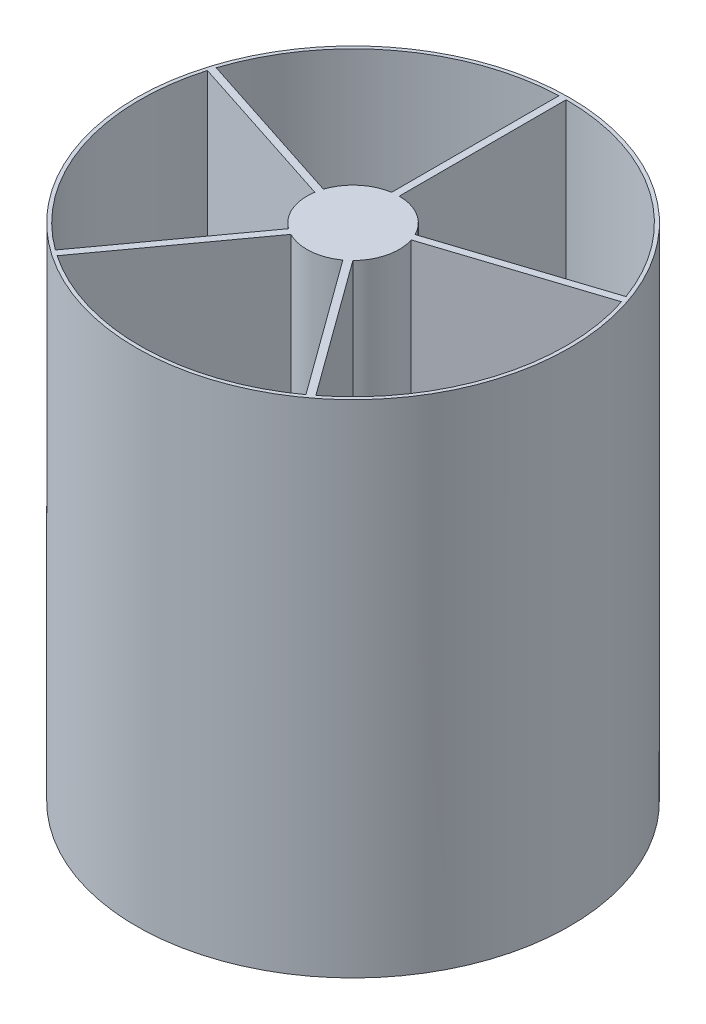
ISO-10303-21;
HEADER;
FILE_DESCRIPTION(('STEP AP214'),'2;1');
FILE_NAME('part.step','',(''),(''),'','','');
FILE_SCHEMA(('AUTOMOTIVE_DESIGN { 1 0 10303 214 1 1 1 1 }'));
ENDSEC;
DATA;
#1=APPLICATION_CONTEXT('core data for automotive mechanical design processes');
#2=APPLICATION_PROTOCOL_DEFINITION('international standard','automotive_design',2000,#1);
#3=PRODUCT_CONTEXT('',#1,'mechanical');
#4=PRODUCT('Part','Part','',(#3));
#5=PRODUCT_RELATED_PRODUCT_CATEGORY('part','',(#4));
#6=PRODUCT_DEFINITION_FORMATION('','',#4);
#7=PRODUCT_DEFINITION_CONTEXT('part definition',#1,'design');
#8=PRODUCT_DEFINITION('design','',#6,#7);
#9=PRODUCT_DEFINITION_SHAPE('','',#8);
#10=(LENGTH_UNIT() NAMED_UNIT(*) SI_UNIT(.MILLI.,.METRE.));
#11=(NAMED_UNIT(*) PLANE_ANGLE_UNIT() SI_UNIT($,.RADIAN.));
#12=(NAMED_UNIT(*) SI_UNIT($,.STERADIAN.) SOLID_ANGLE_UNIT());
#13=UNCERTAINTY_MEASURE_WITH_UNIT(LENGTH_MEASURE(1.E-05),#10,'distance_accuracy_value','');
#14=(GEOMETRIC_REPRESENTATION_CONTEXT(3) GLOBAL_UNCERTAINTY_ASSIGNED_CONTEXT((#13)) GLOBAL_UNIT_ASSIGNED_CONTEXT((#10,
#11,#12)) REPRESENTATION_CONTEXT('',''));
#15=CARTESIAN_POINT('',(0.,0.,0.));
#16=DIRECTION('',(0.,0.,1.));
#17=DIRECTION('',(1.,0.,0.));
#18=AXIS2_PLACEMENT_3D('',#15,#16,#17);
#19=CARTESIAN_POINT('',(0.,700.,0.));
#20=DIRECTION('',(-0.309016994374945,0.,-0.951056516295154));
#21=DIRECTION('',(-0.951056516295154,0.,0.309016994374945));
#22=AXIS2_PLACEMENT_3D('',#19,#20,#21);
#23=PLANE('',#22);
#24=DIRECTION('',(0.951056516295154,0.,-0.309016994374945));
#25=VECTOR('',#24,1.);
#26=CARTESIAN_POINT('',(0.,0.,0.));
#27=LINE('',#26,#25);
#28=CARTESIAN_POINT('',(61.818673559185,0.,-20.0861046343714));
#29=VERTEX_POINT('',#28);
#30=CARTESIAN_POINT('',(285.316954888546,0.,-92.7050983124835));
#31=VERTEX_POINT('',#30);
#32=EDGE_CURVE('E292',#29,#31,#27,.T.);
#33=ORIENTED_EDGE('',*,*,#32,.T.);
#34=DIRECTION('',(0.,-1.,0.));
#35=VECTOR('',#34,1.);
#36=CARTESIAN_POINT('',(285.316954888546,700.,-92.7050983124835));
#37=LINE('',#36,#35);
#38=CARTESIAN_POINT('',(285.316954888546,700.,-92.7050983124835));
#39=VERTEX_POINT('',#38);
#40=EDGE_CURVE('E11',#39,#31,#37,.T.);
#41=ORIENTED_EDGE('',*,*,#40,.F.);
#42=DIRECTION('',(0.951056516295154,0.,-0.309016994374945));
#43=VECTOR('',#42,1.);
#44=CARTESIAN_POINT('',(0.,700.,0.));
#45=LINE('',#44,#43);
#46=CARTESIAN_POINT('',(61.818673559185,700.,-20.0861046343714));
#47=VERTEX_POINT('',#46);
#48=EDGE_CURVE('E173',#47,#39,#45,.T.);
#49=ORIENTED_EDGE('',*,*,#48,.F.);
#50=DIRECTION('',(0.,-1.,0.));
#51=VECTOR('',#50,1.);
#52=CARTESIAN_POINT('',(61.818673559185,700.,-20.0861046343714));
#53=LINE('',#52,#51);
#54=EDGE_CURVE('E298',#47,#29,#53,.T.);
#55=ORIENTED_EDGE('',*,*,#54,.T.);
#56=EDGE_LOOP('',(#33,#41,#49,#55));
#57=FACE_BOUND('',#56,.T.);
#58=ADVANCED_FACE('F42',(#57),#23,.F.);
#59=CARTESIAN_POINT('',(0.,700.,0.));
#60=DIRECTION('',(0.,-1.,0.));
#61=DIRECTION('',(0.,0.,-1.));
#62=AXIS2_PLACEMENT_3D('',#59,#60,#61);
#63=CYLINDRICAL_SURFACE('',#62,300.);
#64=CARTESIAN_POINT('',(0.,0.,0.));
#65=DIRECTION('',(0.,1.,0.));
#66=DIRECTION('',(0.,0.,1.));
#67=AXIS2_PLACEMENT_3D('',#64,#65,#66);
#68=CIRCLE('',#67,300.);
#69=CARTESIAN_POINT('',(184.327754195372,0.,236.692372148515));
#70=VERTEX_POINT('',#69);
#71=EDGE_CURVE('E162',#70,#31,#68,.T.);
#72=ORIENTED_EDGE('',*,*,#71,.F.);
#73=DIRECTION('',(0.,-1.,0.));
#74=VECTOR('',#73,1.);
#75=CARTESIAN_POINT('',(184.327754195372,700.,236.692372148515));
#76=LINE('',#75,#74);
#77=CARTESIAN_POINT('',(184.327754195372,700.,236.692372148515));
#78=VERTEX_POINT('',#77);
#79=EDGE_CURVE('E54',#78,#70,#76,.T.);
#80=ORIENTED_EDGE('',*,*,#79,.F.);
#81=CARTESIAN_POINT('',(0.,700.,0.));
#82=DIRECTION('',(0.,1.,0.));
#83=DIRECTION('',(0.,0.,1.));
#84=AXIS2_PLACEMENT_3D('',#81,#82,#83);
#85=CIRCLE('',#84,300.);
#86=EDGE_CURVE('E160',#78,#39,#85,.T.);
#87=ORIENTED_EDGE('',*,*,#86,.T.);
#88=ORIENTED_EDGE('',*,*,#40,.T.);
#89=EDGE_LOOP('',(#72,#80,#87,#88));
#90=FACE_BOUND('',#89,.T.);
#91=ADVANCED_FACE('F158',(#90),#63,.F.);
#92=CARTESIAN_POINT('',(8.09016994374777,700.,-5.87785252292379));
#93=DIRECTION('',(-0.809016994374933,0.,0.587785252292493));
#94=DIRECTION('',(0.587785252292493,0.,0.809016994374933));
#95=AXIS2_PLACEMENT_3D('',#92,#93,#94);
#96=PLANE('',#95);
#97=DIRECTION('',(-0.587785252292493,0.,-0.809016994374933));
#98=VECTOR('',#97,1.);
#99=CARTESIAN_POINT('',(8.09016994374777,0.,-5.87785252292379));
#100=LINE('',#99,#98);
#101=CARTESIAN_POINT('',(45.8413613037801,0.,46.0822047412696));
#102=VERTEX_POINT('',#101);
#103=EDGE_CURVE('E89',#70,#102,#100,.T.);
#104=ORIENTED_EDGE('',*,*,#103,.T.);
#105=DIRECTION('',(0.,-1.,0.));
#106=VECTOR('',#105,1.);
#107=CARTESIAN_POINT('',(45.8413613037801,700.,46.0822047412696));
#108=LINE('',#107,#106);
#109=CARTESIAN_POINT('',(45.8413613037801,700.,46.0822047412696));
#110=VERTEX_POINT('',#109);
#111=EDGE_CURVE('E164',#110,#102,#108,.T.);
#112=ORIENTED_EDGE('',*,*,#111,.F.);
#113=DIRECTION('',(-0.587785252292493,0.,-0.809016994374933));
#114=VECTOR('',#113,1.);
#115=CARTESIAN_POINT('',(8.09016994374777,700.,-5.87785252292379));
#116=LINE('',#115,#114);
#117=EDGE_CURVE('E166',#78,#110,#116,.T.);
#118=ORIENTED_EDGE('',*,*,#117,.F.);
#119=ORIENTED_EDGE('',*,*,#79,.T.);
#120=EDGE_LOOP('',(#104,#112,#118,#119));
#121=FACE_BOUND('',#120,.T.);
#122=ADVANCED_FACE('F167',(#121),#96,.F.);
#123=CARTESIAN_POINT('',(-168.147414307864,0.,248.448077194369));
#124=VERTEX_POINT('',#123);
#125=CARTESIAN_POINT('',(176.335575687748,0.,242.705098312481));
#126=VERTEX_POINT('',#125);
#127=EDGE_CURVE('E282',#124,#126,#68,.T.);
#128=ORIENTED_EDGE('',*,*,#127,.F.);
#129=DIRECTION('',(0.,-1.,0.));
#130=VECTOR('',#129,1.);
#131=CARTESIAN_POINT('',(-168.147414307864,700.,248.448077194369));
#132=LINE('',#131,#130);
#133=CARTESIAN_POINT('',(-168.147414307864,700.,248.448077194369));
#134=VERTEX_POINT('',#133);
#135=EDGE_CURVE('E301',#134,#124,#132,.T.);
#136=ORIENTED_EDGE('',*,*,#135,.F.);
#137=CARTESIAN_POINT('',(176.335575687748,700.,242.705098312481));
#138=VERTEX_POINT('',#137);
#139=EDGE_CURVE('E177',#134,#138,#85,.T.);
#140=ORIENTED_EDGE('',*,*,#139,.T.);
#141=DIRECTION('',(0.,-1.,0.));
#142=VECTOR('',#141,1.);
#143=CARTESIAN_POINT('',(176.335575687748,700.,242.705098312481));
#144=LINE('',#143,#142);
#145=EDGE_CURVE('E304',#138,#126,#144,.T.);
#146=ORIENTED_EDGE('',*,*,#145,.T.);
#147=EDGE_LOOP('',(#128,#136,#140,#146));
#148=FACE_BOUND('',#147,.T.);
#149=ADVANCED_FACE('F471',(#148),#63,.F.);
#150=CARTESIAN_POINT('',(8.09016994374798,700.,5.87785252292336));
#151=DIRECTION('',(-0.809016994374961,0.,-0.587785252292455));
#152=DIRECTION('',(-0.587785252292455,0.,0.809016994374961));
#153=AXIS2_PLACEMENT_3D('',#150,#151,#152);
#154=PLANE('',#153);
#155=DIRECTION('',(0.587785252292455,0.,-0.809016994374961));
#156=VECTOR('',#155,1.);
#157=CARTESIAN_POINT('',(8.09016994374798,0.,5.87785252292336));
#158=LINE('',#157,#156);
#159=CARTESIAN_POINT('',(-29.6610214162819,0.,57.8379097871186));
#160=VERTEX_POINT('',#159);
#161=EDGE_CURVE('E283',#124,#160,#158,.T.);
#162=ORIENTED_EDGE('',*,*,#161,.T.);
#163=DIRECTION('',(0.,-1.,0.));
#164=VECTOR('',#163,1.);
#165=CARTESIAN_POINT('',(-29.6610214162819,700.,57.8379097871186));
#166=LINE('',#165,#164);
#167=CARTESIAN_POINT('',(-29.6610214162819,700.,57.8379097871186));
#168=VERTEX_POINT('',#167);
#169=EDGE_CURVE('E313',#168,#160,#166,.T.);
#170=ORIENTED_EDGE('',*,*,#169,.F.);
#171=DIRECTION('',(0.587785252292455,0.,-0.809016994374961));
#172=VECTOR('',#171,1.);
#173=CARTESIAN_POINT('',(8.09016994374798,700.,5.87785252292336));
#174=LINE('',#173,#172);
#175=EDGE_CURVE('E186',#134,#168,#174,.T.);
#176=ORIENTED_EDGE('',*,*,#175,.F.);
#177=ORIENTED_EDGE('',*,*,#135,.T.);
#178=EDGE_LOOP('',(#162,#170,#176,#177));
#179=FACE_BOUND('',#178,.T.);
#180=ADVANCED_FACE('F477',(#179),#154,.F.);
#181=CARTESIAN_POINT('',(0.,700.,0.));
#182=DIRECTION('',(0.,-1.,0.));
#183=DIRECTION('',(0.,0.,-1.));
#184=AXIS2_PLACEMENT_3D('',#181,#182,#183);
#185=CYLINDRICAL_SURFACE('',#184,65.);
#186=CARTESIAN_POINT('',(0.,0.,0.));
#187=DIRECTION('',(0.,1.,0.));
#188=DIRECTION('',(0.,0.,1.));
#189=AXIS2_PLACEMENT_3D('',#186,#187,#188);
#190=CIRCLE('',#189,65.);
#191=CARTESIAN_POINT('',(38.2060413990123,0.,52.5861046343712));
#192=VERTEX_POINT('',#191);
#193=EDGE_CURVE('E287',#160,#192,#190,.T.);
#194=ORIENTED_EDGE('',*,*,#193,.T.);
#195=DIRECTION('',(0.,-1.,0.));
#196=VECTOR('',#195,1.);
#197=CARTESIAN_POINT('',(38.2060413990123,700.,52.5861046343712));
#198=LINE('',#197,#196);
#199=CARTESIAN_POINT('',(38.2060413990123,700.,52.5861046343712));
#200=VERTEX_POINT('',#199);
#201=EDGE_CURVE('E308',#200,#192,#198,.T.);
#202=ORIENTED_EDGE('',*,*,#201,.F.);
#203=CARTESIAN_POINT('',(0.,700.,0.));
#204=DIRECTION('',(0.,1.,0.));
#205=DIRECTION('',(0.,0.,1.));
#206=AXIS2_PLACEMENT_3D('',#203,#204,#205);
#207=CIRCLE('',#206,65.);
#208=EDGE_CURVE('E237',#168,#200,#207,.T.);
#209=ORIENTED_EDGE('',*,*,#208,.F.);
#210=ORIENTED_EDGE('',*,*,#169,.T.);
#211=EDGE_LOOP('',(#194,#202,#209,#210));
#212=FACE_BOUND('',#211,.T.);
#213=ADVANCED_FACE('F433',(#212),#185,.T.);
#214=CARTESIAN_POINT('',(-288.248571358039,0.,-83.1430160028443));
#215=VERTEX_POINT('',#214);
#216=CARTESIAN_POINT('',(-176.335575687735,0.,242.705098312487));
#217=VERTEX_POINT('',#216);
#218=EDGE_CURVE('E272',#215,#217,#68,.T.);
#219=ORIENTED_EDGE('',*,*,#218,.F.);
#220=DIRECTION('',(0.,-1.,0.));
#221=VECTOR('',#220,1.);
#222=CARTESIAN_POINT('',(-288.248571358039,700.,-83.1430160028443));
#223=LINE('',#222,#221);
#224=CARTESIAN_POINT('',(-288.248571358039,700.,-83.1430160028443));
#225=VERTEX_POINT('',#224);
#226=EDGE_CURVE('E309',#225,#215,#223,.T.);
#227=ORIENTED_EDGE('',*,*,#226,.F.);
#228=CARTESIAN_POINT('',(-176.335575687735,700.,242.705098312487));
#229=VERTEX_POINT('',#228);
#230=EDGE_CURVE('E188',#225,#229,#85,.T.);
#231=ORIENTED_EDGE('',*,*,#230,.T.);
#232=DIRECTION('',(0.,-1.,0.));
#233=VECTOR('',#232,1.);
#234=CARTESIAN_POINT('',(-176.335575687735,700.,242.705098312487));
#235=LINE('',#234,#233);
#236=EDGE_CURVE('E320',#229,#217,#235,.T.);
#237=ORIENTED_EDGE('',*,*,#236,.T.);
#238=EDGE_LOOP('',(#219,#227,#231,#237));
#239=FACE_BOUND('',#238,.T.);
#240=ADVANCED_FACE('F487',(#239),#63,.F.);
#241=CARTESIAN_POINT('',(-3.09016994374957,700.,9.51056516295147));
#242=DIRECTION('',(0.309016994374958,0.,-0.95105651629515));
#243=DIRECTION('',(-0.95105651629515,0.,-0.309016994374958));
#244=AXIS2_PLACEMENT_3D('',#241,#242,#243);
#245=PLANE('',#244);
#246=DIRECTION('',(0.95105651629515,0.,0.309016994374958));
#247=VECTOR('',#246,1.);
#248=CARTESIAN_POINT('',(-3.09016994374957,0.,9.51056516295147));
#249=LINE('',#248,#247);
#250=CARTESIAN_POINT('',(-64.1728806800807,0.,-10.3364106545805));
#251=VERTEX_POINT('',#250);
#252=EDGE_CURVE('E273',#215,#251,#249,.T.);
#253=ORIENTED_EDGE('',*,*,#252,.T.);
#254=DIRECTION('',(0.,-1.,0.));
#255=VECTOR('',#254,1.);
#256=CARTESIAN_POINT('',(-64.1728806800807,700.,-10.3364106545805));
#257=LINE('',#256,#255);
#258=CARTESIAN_POINT('',(-64.1728806800807,700.,-10.3364106545805));
#259=VERTEX_POINT('',#258);
#260=EDGE_CURVE('E328',#259,#251,#257,.T.);
#261=ORIENTED_EDGE('',*,*,#260,.F.);
#262=DIRECTION('',(0.95105651629515,0.,0.309016994374958));
#263=VECTOR('',#262,1.);
#264=CARTESIAN_POINT('',(-3.09016994374957,700.,9.51056516295147));
#265=LINE('',#264,#263);
#266=EDGE_CURVE('E215',#225,#259,#265,.T.);
#267=ORIENTED_EDGE('',*,*,#266,.F.);
#268=ORIENTED_EDGE('',*,*,#226,.T.);
#269=EDGE_LOOP('',(#253,#261,#267,#268));
#270=FACE_BOUND('',#269,.T.);
#271=ADVANCED_FACE('F484',(#270),#245,.F.);
#272=CARTESIAN_POINT('',(-38.2060413990091,0.,52.5861046343719));
#273=VERTEX_POINT('',#272);
#274=EDGE_CURVE('E277',#251,#273,#190,.T.);
#275=ORIENTED_EDGE('',*,*,#274,.T.);
#276=DIRECTION('',(0.,-1.,0.));
#277=VECTOR('',#276,1.);
#278=CARTESIAN_POINT('',(-38.2060413990091,700.,52.5861046343719));
#279=LINE('',#278,#277);
#280=CARTESIAN_POINT('',(-38.2060413990091,700.,52.5861046343719));
#281=VERTEX_POINT('',#280);
#282=EDGE_CURVE('E323',#281,#273,#279,.T.);
#283=ORIENTED_EDGE('',*,*,#282,.F.);
#284=EDGE_CURVE('E223',#259,#281,#207,.T.);
#285=ORIENTED_EDGE('',*,*,#284,.F.);
#286=ORIENTED_EDGE('',*,*,#260,.T.);
#287=EDGE_LOOP('',(#275,#283,#285,#286));
#288=FACE_BOUND('',#287,.T.);
#289=ADVANCED_FACE('F486',(#288),#185,.T.);
#290=CARTESIAN_POINT('',(-10.,0.,-299.833287011299));
#291=VERTEX_POINT('',#290);
#292=CARTESIAN_POINT('',(-285.316954888545,0.,-92.7050983124875));
#293=VERTEX_POINT('',#292);
#294=EDGE_CURVE('E251',#291,#293,#68,.T.);
#295=ORIENTED_EDGE('',*,*,#294,.F.);
#296=DIRECTION('',(0.,-1.,0.));
#297=VECTOR('',#296,1.);
#298=CARTESIAN_POINT('',(-10.,700.,-299.833287011299));
#299=LINE('',#298,#297);
#300=CARTESIAN_POINT('',(-10.,700.,-299.833287011299));
#301=VERTEX_POINT('',#300);
#302=EDGE_CURVE('E324',#301,#291,#299,.T.);
#303=ORIENTED_EDGE('',*,*,#302,.F.);
#304=CARTESIAN_POINT('',(-285.316954888545,700.,-92.7050983124875));
#305=VERTEX_POINT('',#304);
#306=EDGE_CURVE('E192',#301,#305,#85,.T.);
#307=ORIENTED_EDGE('',*,*,#306,.T.);
#308=DIRECTION('',(0.,-1.,0.));
#309=VECTOR('',#308,1.);
#310=CARTESIAN_POINT('',(-285.316954888545,700.,-92.7050983124875));
#311=LINE('',#310,#309);
#312=EDGE_CURVE('E335',#305,#293,#311,.T.);
#313=ORIENTED_EDGE('',*,*,#312,.T.);
#314=EDGE_LOOP('',(#295,#303,#307,#313));
#315=FACE_BOUND('',#314,.T.);
#316=ADVANCED_FACE('F415',(#315),#63,.F.);
#317=CARTESIAN_POINT('',(-9.99999999999997,700.,0.));
#318=DIRECTION('',(1.,0.,0.));
#319=DIRECTION('',(0.,0.,-1.));
#320=AXIS2_PLACEMENT_3D('',#317,#318,#319);
#321=PLANE('',#320);
#322=DIRECTION('',(0.,0.,1.));
#323=VECTOR('',#322,1.);
#324=CARTESIAN_POINT('',(-9.99999999999997,0.,0.));
#325=LINE('',#324,#323);
#326=CARTESIAN_POINT('',(-9.99999999999997,0.,-64.2261628933257));
#327=VERTEX_POINT('',#326);
#328=EDGE_CURVE('E264',#291,#327,#325,.T.);
#329=ORIENTED_EDGE('',*,*,#328,.T.);
#330=DIRECTION('',(0.,-1.,0.));
#331=VECTOR('',#330,1.);
#332=CARTESIAN_POINT('',(-9.99999999999997,700.,-64.2261628933257));
#333=LINE('',#332,#331);
#334=CARTESIAN_POINT('',(-9.99999999999997,700.,-64.2261628933257));
#335=VERTEX_POINT('',#334);
#336=EDGE_CURVE('E342',#335,#327,#333,.T.);
#337=ORIENTED_EDGE('',*,*,#336,.F.);
#338=DIRECTION('',(0.,0.,1.));
#339=VECTOR('',#338,1.);
#340=CARTESIAN_POINT('',(-9.99999999999997,700.,0.));
#341=LINE('',#340,#339);
#342=EDGE_CURVE('E202',#301,#335,#341,.T.);
#343=ORIENTED_EDGE('',*,*,#342,.F.);
#344=ORIENTED_EDGE('',*,*,#302,.T.);
#345=EDGE_LOOP('',(#329,#337,#343,#344));
#346=FACE_BOUND('',#345,.T.);
#347=ADVANCED_FACE('F489',(#346),#321,.F.);
#348=CARTESIAN_POINT('',(-61.8186735591848,0.,-20.0861046343723));
#349=VERTEX_POINT('',#348);
#350=EDGE_CURVE('E260',#327,#349,#190,.T.);
#351=ORIENTED_EDGE('',*,*,#350,.T.);
#352=DIRECTION('',(0.,-1.,0.));
#353=VECTOR('',#352,1.);
#354=CARTESIAN_POINT('',(-61.8186735591848,700.,-20.0861046343723));
#355=LINE('',#354,#353);
#356=CARTESIAN_POINT('',(-61.8186735591848,700.,-20.0861046343723));
#357=VERTEX_POINT('',#356);
#358=EDGE_CURVE('E338',#357,#349,#355,.T.);
#359=ORIENTED_EDGE('',*,*,#358,.F.);
#360=EDGE_CURVE('E210',#335,#357,#207,.T.);
#361=ORIENTED_EDGE('',*,*,#360,.F.);
#362=ORIENTED_EDGE('',*,*,#336,.T.);
#363=EDGE_LOOP('',(#351,#359,#361,#362));
#364=FACE_BOUND('',#363,.T.);
#365=ADVANCED_FACE('F421',(#364),#185,.T.);
#366=CARTESIAN_POINT('',(282.068231470542,0.,-102.164146328743));
#367=VERTEX_POINT('',#366);
#368=CARTESIAN_POINT('',(0.,0.,-300.));
#369=VERTEX_POINT('',#368);
#370=EDGE_CURVE('E245',#367,#369,#68,.T.);
#371=ORIENTED_EDGE('',*,*,#370,.F.);
#372=DIRECTION('',(0.,-1.,0.));
#373=VECTOR('',#372,1.);
#374=CARTESIAN_POINT('',(282.068231470542,700.,-102.164146328743));
#375=LINE('',#374,#373);
#376=CARTESIAN_POINT('',(282.068231470542,700.,-102.164146328743));
#377=VERTEX_POINT('',#376);
#378=EDGE_CURVE('E46',#377,#367,#375,.T.);
#379=ORIENTED_EDGE('',*,*,#378,.F.);
#380=CARTESIAN_POINT('',(0.,700.,-300.));
#381=VERTEX_POINT('',#380);
#382=EDGE_CURVE('E178',#377,#381,#85,.T.);
#383=ORIENTED_EDGE('',*,*,#382,.T.);
#384=DIRECTION('',(0.,-1.,0.));
#385=VECTOR('',#384,1.);
#386=CARTESIAN_POINT('',(0.,700.,-300.));
#387=LINE('',#386,#385);
#388=EDGE_CURVE('E244',#381,#369,#387,.T.);
#389=ORIENTED_EDGE('',*,*,#388,.T.);
#390=EDGE_LOOP('',(#371,#379,#383,#389));
#391=FACE_BOUND('',#390,.T.);
#392=ADVANCED_FACE('F367',(#391),#63,.F.);
#393=CARTESIAN_POINT('',(-3.09016994374943,700.,-9.5105651629515));
#394=DIRECTION('',(0.309016994374945,0.,0.951056516295154));
#395=DIRECTION('',(0.951056516295154,0.,-0.309016994374945));
#396=AXIS2_PLACEMENT_3D('',#393,#394,#395);
#397=PLANE('',#396);
#398=DIRECTION('',(-0.951056516295154,0.,0.309016994374945));
#399=VECTOR('',#398,1.);
#400=CARTESIAN_POINT('',(-3.09016994374943,0.,-9.5105651629515));
#401=LINE('',#400,#399);
#402=CARTESIAN_POINT('',(57.992540792582,0.,-29.3575409804826));
#403=VERTEX_POINT('',#402);
#404=EDGE_CURVE('E249',#367,#403,#401,.T.);
#405=ORIENTED_EDGE('',*,*,#404,.T.);
#406=DIRECTION('',(0.,-1.,0.));
#407=VECTOR('',#406,1.);
#408=CARTESIAN_POINT('',(57.992540792582,700.,-29.3575409804826));
#409=LINE('',#408,#407);
#410=CARTESIAN_POINT('',(57.992540792582,700.,-29.3575409804826));
#411=VERTEX_POINT('',#410);
#412=EDGE_CURVE('E354',#411,#403,#409,.T.);
#413=ORIENTED_EDGE('',*,*,#412,.F.);
#414=DIRECTION('',(-0.951056516295154,0.,0.309016994374945));
#415=VECTOR('',#414,1.);
#416=CARTESIAN_POINT('',(-3.09016994374943,700.,-9.5105651629515));
#417=LINE('',#416,#415);
#418=EDGE_CURVE('E190',#377,#411,#417,.T.);
#419=ORIENTED_EDGE('',*,*,#418,.F.);
#420=ORIENTED_EDGE('',*,*,#378,.T.);
#421=EDGE_LOOP('',(#405,#413,#419,#420));
#422=FACE_BOUND('',#421,.T.);
#423=ADVANCED_FACE('F44',(#422),#397,.F.);
#424=CARTESIAN_POINT('',(0.,0.,-65.));
#425=VERTEX_POINT('',#424);
#426=EDGE_CURVE('E255',#403,#425,#190,.T.);
#427=ORIENTED_EDGE('',*,*,#426,.T.);
#428=DIRECTION('',(0.,-1.,0.));
#429=VECTOR('',#428,1.);
#430=CARTESIAN_POINT('',(0.,700.,-65.));
#431=LINE('',#430,#429);
#432=CARTESIAN_POINT('',(0.,700.,-65.));
#433=VERTEX_POINT('',#432);
#434=EDGE_CURVE('E351',#433,#425,#431,.T.);
#435=ORIENTED_EDGE('',*,*,#434,.F.);
#436=EDGE_CURVE('E197',#411,#433,#207,.T.);
#437=ORIENTED_EDGE('',*,*,#436,.F.);
#438=ORIENTED_EDGE('',*,*,#412,.T.);
#439=EDGE_LOOP('',(#427,#435,#437,#438));
#440=FACE_BOUND('',#439,.T.);
#441=ADVANCED_FACE('F451',(#440),#185,.T.);
#442=EDGE_CURVE('E95',#102,#29,#190,.T.);
#443=ORIENTED_EDGE('',*,*,#442,.T.);
#444=ORIENTED_EDGE('',*,*,#54,.F.);
#445=EDGE_CURVE('E63',#110,#47,#207,.T.);
#446=ORIENTED_EDGE('',*,*,#445,.F.);
#447=ORIENTED_EDGE('',*,*,#111,.T.);
#448=EDGE_LOOP('',(#443,#444,#446,#447));
#449=FACE_BOUND('',#448,.T.);
#450=ADVANCED_FACE('F476',(#449),#185,.T.);
#451=CARTESIAN_POINT('',(0.,700.,0.));
#452=DIRECTION('',(0.809016994374934,0.,-0.587785252292492));
#453=DIRECTION('',(-0.587785252292492,0.,-0.809016994374934));
#454=AXIS2_PLACEMENT_3D('',#451,#452,#453);
#455=PLANE('',#454);
#456=DIRECTION('',(0.587785252292492,0.,0.809016994374934));
#457=VECTOR('',#456,1.);
#458=CARTESIAN_POINT('',(0.,0.,0.));
#459=LINE('',#458,#457);
#460=EDGE_CURVE('E288',#192,#126,#459,.T.);
#461=ORIENTED_EDGE('',*,*,#460,.T.);
#462=ORIENTED_EDGE('',*,*,#145,.F.);
#463=DIRECTION('',(0.587785252292492,0.,0.809016994374934));
#464=VECTOR('',#463,1.);
#465=CARTESIAN_POINT('',(0.,700.,0.));
#466=LINE('',#465,#464);
#467=EDGE_CURVE('E180',#200,#138,#466,.T.);
#468=ORIENTED_EDGE('',*,*,#467,.F.);
#469=ORIENTED_EDGE('',*,*,#201,.T.);
#470=EDGE_LOOP('',(#461,#462,#468,#469));
#471=FACE_BOUND('',#470,.T.);
#472=ADVANCED_FACE('F438',(#471),#455,.F.);
#473=CARTESIAN_POINT('',(0.,700.,0.));
#474=DIRECTION('',(0.809016994374961,0.,0.587785252292454));
#475=DIRECTION('',(0.587785252292454,0.,-0.809016994374961));
#476=AXIS2_PLACEMENT_3D('',#473,#474,#475);
#477=PLANE('',#476);
#478=DIRECTION('',(-0.587785252292454,0.,0.809016994374961));
#479=VECTOR('',#478,1.);
#480=CARTESIAN_POINT('',(0.,0.,0.));
#481=LINE('',#480,#479);
#482=EDGE_CURVE('E278',#273,#217,#481,.T.);
#483=ORIENTED_EDGE('',*,*,#482,.T.);
#484=ORIENTED_EDGE('',*,*,#236,.F.);
#485=DIRECTION('',(-0.587785252292454,0.,0.809016994374961));
#486=VECTOR('',#485,1.);
#487=CARTESIAN_POINT('',(0.,700.,0.));
#488=LINE('',#487,#486);
#489=EDGE_CURVE('E187',#281,#229,#488,.T.);
#490=ORIENTED_EDGE('',*,*,#489,.F.);
#491=ORIENTED_EDGE('',*,*,#282,.T.);
#492=EDGE_LOOP('',(#483,#484,#490,#491));
#493=FACE_BOUND('',#492,.T.);
#494=ADVANCED_FACE('F462',(#493),#477,.F.);
#495=CARTESIAN_POINT('',(0.,700.,0.));
#496=DIRECTION('',(-0.309016994374958,0.,0.95105651629515));
#497=DIRECTION('',(0.95105651629515,0.,0.309016994374958));
#498=AXIS2_PLACEMENT_3D('',#495,#496,#497);
#499=PLANE('',#498);
#500=DIRECTION('',(-0.95105651629515,0.,-0.309016994374958));
#501=VECTOR('',#500,1.);
#502=CARTESIAN_POINT('',(0.,0.,0.));
#503=LINE('',#502,#501);
#504=EDGE_CURVE('E268',#349,#293,#503,.T.);
#505=ORIENTED_EDGE('',*,*,#504,.T.);
#506=ORIENTED_EDGE('',*,*,#312,.F.);
#507=DIRECTION('',(-0.95105651629515,0.,-0.309016994374958));
#508=VECTOR('',#507,1.);
#509=CARTESIAN_POINT('',(0.,700.,0.));
#510=LINE('',#509,#508);
#511=EDGE_CURVE('E216',#357,#305,#510,.T.);
#512=ORIENTED_EDGE('',*,*,#511,.F.);
#513=ORIENTED_EDGE('',*,*,#358,.T.);
#514=EDGE_LOOP('',(#505,#506,#512,#513));
#515=FACE_BOUND('',#514,.T.);
#516=ADVANCED_FACE('F417',(#515),#499,.F.);
#517=CARTESIAN_POINT('',(0.,700.,0.));
#518=DIRECTION('',(-1.,0.,0.));
#519=DIRECTION('',(0.,0.,1.));
#520=AXIS2_PLACEMENT_3D('',#517,#518,#519);
#521=PLANE('',#520);
#522=DIRECTION('',(0.,0.,-1.));
#523=VECTOR('',#522,1.);
#524=CARTESIAN_POINT('',(0.,0.,0.));
#525=LINE('',#524,#523);
#526=EDGE_CURVE('E259',#425,#369,#525,.T.);
#527=ORIENTED_EDGE('',*,*,#526,.T.);
#528=ORIENTED_EDGE('',*,*,#388,.F.);
#529=DIRECTION('',(0.,0.,-1.));
#530=VECTOR('',#529,1.);
#531=CARTESIAN_POINT('',(0.,700.,0.));
#532=LINE('',#531,#530);
#533=EDGE_CURVE('E203',#433,#381,#532,.T.);
#534=ORIENTED_EDGE('',*,*,#533,.F.);
#535=ORIENTED_EDGE('',*,*,#434,.T.);
#536=EDGE_LOOP('',(#527,#528,#534,#535));
#537=FACE_BOUND('',#536,.T.);
#538=ADVANCED_FACE('F453',(#537),#521,.F.);
#539=CARTESIAN_POINT('',(0.,700.,0.));
#540=DIRECTION('',(0.,-1.,0.));
#541=DIRECTION('',(0.,0.,-1.));
#542=AXIS2_PLACEMENT_3D('',#539,#540,#541);
#543=CYLINDRICAL_SURFACE('',#542,305.);
#544=CARTESIAN_POINT('',(0.,700.,0.));
#545=DIRECTION('',(0.,1.,0.));
#546=DIRECTION('',(0.,0.,1.));
#547=AXIS2_PLACEMENT_3D('',#544,#545,#546);
#548=CIRCLE('',#547,305.);
#549=CARTESIAN_POINT('',(0.,700.,305.));
#550=VERTEX_POINT('',#549);
#551=EDGE_CURVE('E240',#550,#550,#548,.T.);
#552=ORIENTED_EDGE('',*,*,#551,.F.);
#553=EDGE_LOOP('',(#552));
#554=FACE_BOUND('',#553,.T.);
#555=CARTESIAN_POINT('',(0.,-5.,0.));
#556=DIRECTION('',(0.,-1.,0.));
#557=DIRECTION('',(0.,0.,-1.));
#558=AXIS2_PLACEMENT_3D('',#555,#556,#557);
#559=CIRCLE('',#558,305.);
#560=CARTESIAN_POINT('',(0.,-5.,-305.));
#561=VERTEX_POINT('',#560);
#562=EDGE_CURVE('E250',#561,#561,#559,.T.);
#563=ORIENTED_EDGE('',*,*,#562,.F.);
#564=EDGE_LOOP('',(#563));
#565=FACE_BOUND('',#564,.T.);
#566=ADVANCED_FACE('F455',(#554,#565),#543,.T.);
#567=CARTESIAN_POINT('',(0.,700.,0.));
#568=DIRECTION('',(0.,1.,0.));
#569=DIRECTION('',(0.,0.,1.));
#570=AXIS2_PLACEMENT_3D('',#567,#568,#569);
#571=PLANE('',#570);
#572=ORIENTED_EDGE('',*,*,#382,.F.);
#573=ORIENTED_EDGE('',*,*,#418,.T.);
#574=ORIENTED_EDGE('',*,*,#436,.T.);
#575=ORIENTED_EDGE('',*,*,#533,.T.);
#576=EDGE_LOOP('',(#572,#573,#574,#575));
#577=FACE_BOUND('',#576,.T.);
#578=ORIENTED_EDGE('',*,*,#306,.F.);
#579=ORIENTED_EDGE('',*,*,#342,.T.);
#580=ORIENTED_EDGE('',*,*,#360,.T.);
#581=ORIENTED_EDGE('',*,*,#511,.T.);
#582=EDGE_LOOP('',(#578,#579,#580,#581));
#583=FACE_BOUND('',#582,.T.);
#584=ORIENTED_EDGE('',*,*,#230,.F.);
#585=ORIENTED_EDGE('',*,*,#266,.T.);
#586=ORIENTED_EDGE('',*,*,#284,.T.);
#587=ORIENTED_EDGE('',*,*,#489,.T.);
#588=EDGE_LOOP('',(#584,#585,#586,#587));
#589=FACE_BOUND('',#588,.T.);
#590=ORIENTED_EDGE('',*,*,#139,.F.);
#591=ORIENTED_EDGE('',*,*,#175,.T.);
#592=ORIENTED_EDGE('',*,*,#208,.T.);
#593=ORIENTED_EDGE('',*,*,#467,.T.);
#594=EDGE_LOOP('',(#590,#591,#592,#593));
#595=FACE_BOUND('',#594,.T.);
#596=ORIENTED_EDGE('',*,*,#48,.T.);
#597=ORIENTED_EDGE('',*,*,#86,.F.);
#598=ORIENTED_EDGE('',*,*,#117,.T.);
#599=ORIENTED_EDGE('',*,*,#445,.T.);
#600=EDGE_LOOP('',(#596,#597,#598,#599));
#601=FACE_BOUND('',#600,.T.);
#602=ORIENTED_EDGE('',*,*,#551,.T.);
#603=EDGE_LOOP('',(#602));
#604=FACE_BOUND('',#603,.T.);
#605=ADVANCED_FACE('F170',(#577,#583,#589,#595,#601,#604),#571,.T.);
#606=CARTESIAN_POINT('',(0.,0.,0.));
#607=DIRECTION('',(0.,-1.,0.));
#608=DIRECTION('',(0.,0.,-1.));
#609=AXIS2_PLACEMENT_3D('',#606,#607,#608);
#610=PLANE('',#609);
#611=ORIENTED_EDGE('',*,*,#32,.F.);
#612=ORIENTED_EDGE('',*,*,#442,.F.);
#613=ORIENTED_EDGE('',*,*,#103,.F.);
#614=ORIENTED_EDGE('',*,*,#71,.T.);
#615=EDGE_LOOP('',(#611,#612,#613,#614));
#616=FACE_BOUND('',#615,.T.);
#617=ADVANCED_FACE('F403',(#616),#610,.F.);
#618=ORIENTED_EDGE('',*,*,#161,.F.);
#619=ORIENTED_EDGE('',*,*,#127,.T.);
#620=ORIENTED_EDGE('',*,*,#460,.F.);
#621=ORIENTED_EDGE('',*,*,#193,.F.);
#622=EDGE_LOOP('',(#618,#619,#620,#621));
#623=FACE_BOUND('',#622,.T.);
#624=ADVANCED_FACE('F435',(#623),#610,.F.);
#625=ORIENTED_EDGE('',*,*,#252,.F.);
#626=ORIENTED_EDGE('',*,*,#218,.T.);
#627=ORIENTED_EDGE('',*,*,#482,.F.);
#628=ORIENTED_EDGE('',*,*,#274,.F.);
#629=EDGE_LOOP('',(#625,#626,#627,#628));
#630=FACE_BOUND('',#629,.T.);
#631=ADVANCED_FACE('F705',(#630),#610,.F.);
#632=ORIENTED_EDGE('',*,*,#328,.F.);
#633=ORIENTED_EDGE('',*,*,#294,.T.);
#634=ORIENTED_EDGE('',*,*,#504,.F.);
#635=ORIENTED_EDGE('',*,*,#350,.F.);
#636=EDGE_LOOP('',(#632,#633,#634,#635));
#637=FACE_BOUND('',#636,.T.);
#638=ADVANCED_FACE('F414',(#637),#610,.F.);
#639=ORIENTED_EDGE('',*,*,#404,.F.);
#640=ORIENTED_EDGE('',*,*,#370,.T.);
#641=ORIENTED_EDGE('',*,*,#526,.F.);
#642=ORIENTED_EDGE('',*,*,#426,.F.);
#643=EDGE_LOOP('',(#639,#640,#641,#642));
#644=FACE_BOUND('',#643,.T.);
#645=ADVANCED_FACE('F371',(#644),#610,.F.);
#646=CARTESIAN_POINT('',(0.,-5.,0.));
#647=DIRECTION('',(0.,-1.,0.));
#648=DIRECTION('',(0.,0.,-1.));
#649=AXIS2_PLACEMENT_3D('',#646,#647,#648);
#650=PLANE('',#649);
#651=ORIENTED_EDGE('',*,*,#562,.T.);
#652=EDGE_LOOP('',(#651));
#653=FACE_BOUND('',#652,.T.);
#654=ADVANCED_FACE('F726',(#653),#650,.T.);
#655=CLOSED_SHELL('',(#58,#91,#122,#149,#180,#213,#240,#271,#289,#316,#347,#365,#392,#423,#441,
#450,#472,#494,#516,#538,#566,#605,#617,#624,#631,#638,#645,#654));
#656=CARTESIAN_POINT('',(0.,695.,0.));
#657=DIRECTION('',(0.,1.,0.));
#658=DIRECTION('',(0.,0.,1.));
#659=AXIS2_PLACEMENT_3D('',#656,#657,#658);
#660=PLANE('',#659);
#661=CARTESIAN_POINT('',(0.,695.,0.));
#662=DIRECTION('',(0.,1.,0.));
#663=DIRECTION('',(0.,0.,1.));
#664=AXIS2_PLACEMENT_3D('',#661,#662,#663);
#665=CIRCLE('',#664,60.);
#666=CARTESIAN_POINT('',(0.,695.,60.));
#667=VERTEX_POINT('',#666);
#668=EDGE_CURVE('E740',#667,#667,#665,.T.);
#669=ORIENTED_EDGE('',*,*,#668,.F.);
#670=EDGE_LOOP('',(#669));
#671=FACE_BOUND('',#670,.T.);
#672=ADVANCED_FACE('F669',(#671),#660,.F.);
#673=CARTESIAN_POINT('',(0.,0.,0.));
#674=DIRECTION('',(0.,1.,0.));
#675=DIRECTION('',(0.,0.,1.));
#676=AXIS2_PLACEMENT_3D('',#673,#674,#675);
#677=CIRCLE('',#676,60.);
#678=CARTESIAN_POINT('',(0.,0.,60.));
#679=VERTEX_POINT('',#678);
#680=EDGE_CURVE('E191',#679,#679,#677,.T.);
#681=ORIENTED_EDGE('',*,*,#680,.T.);
#682=EDGE_LOOP('',(#681));
#683=FACE_BOUND('',#682,.T.);
#684=ADVANCED_FACE('F673',(#683),#610,.F.);
#685=CARTESIAN_POINT('',(0.,700.,0.));
#686=DIRECTION('',(0.,-1.,0.));
#687=DIRECTION('',(0.,0.,-1.));
#688=AXIS2_PLACEMENT_3D('',#685,#686,#687);
#689=CYLINDRICAL_SURFACE('',#688,60.);
#690=ORIENTED_EDGE('',*,*,#680,.F.);
#691=EDGE_LOOP('',(#690));
#692=FACE_BOUND('',#691,.T.);
#693=ORIENTED_EDGE('',*,*,#668,.T.);
#694=EDGE_LOOP('',(#693));
#695=FACE_BOUND('',#694,.T.);
#696=ADVANCED_FACE('F664',(#692,#695),#689,.F.);
#697=CLOSED_SHELL('',(#672,#684,#696));
#698=ORIENTED_CLOSED_SHELL('',*,#697,.T.);
#699=BREP_WITH_VOIDS('B2',#655,(#698));
#700=ADVANCED_BREP_SHAPE_REPRESENTATION('',(#18,#699),#14);
#701=SHAPE_DEFINITION_REPRESENTATION(#9,#700);
ENDSEC;
END-ISO-10303-21;
